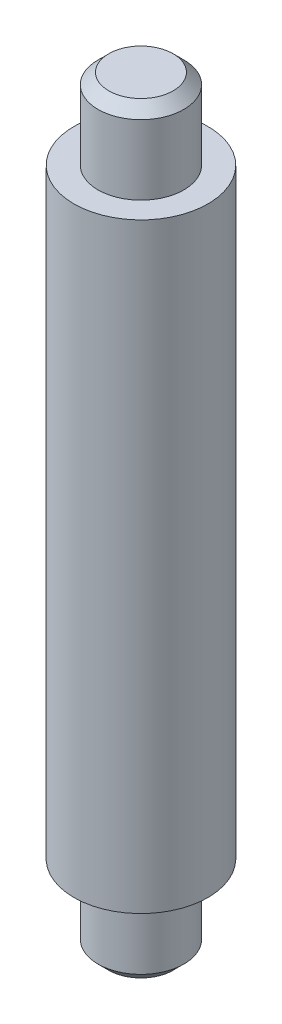
ISO-10303-21;
HEADER;
FILE_DESCRIPTION(('STEP AP214'),'2;1');
FILE_NAME('part.step','',(''),(''),'','','');
FILE_SCHEMA(('AUTOMOTIVE_DESIGN { 1 0 10303 214 1 1 1 1 }'));
ENDSEC;
DATA;
#1=APPLICATION_CONTEXT('core data for automotive mechanical design processes');
#2=APPLICATION_PROTOCOL_DEFINITION('international standard','automotive_design',2000,#1);
#3=PRODUCT_CONTEXT('',#1,'mechanical');
#4=PRODUCT('Part','Part','',(#3));
#5=PRODUCT_RELATED_PRODUCT_CATEGORY('part','',(#4));
#6=PRODUCT_DEFINITION_FORMATION('','',#4);
#7=PRODUCT_DEFINITION_CONTEXT('part definition',#1,'design');
#8=PRODUCT_DEFINITION('design','',#6,#7);
#9=PRODUCT_DEFINITION_SHAPE('','',#8);
#10=(LENGTH_UNIT() NAMED_UNIT(*) SI_UNIT(.MILLI.,.METRE.));
#11=(NAMED_UNIT(*) PLANE_ANGLE_UNIT() SI_UNIT($,.RADIAN.));
#12=(NAMED_UNIT(*) SI_UNIT($,.STERADIAN.) SOLID_ANGLE_UNIT());
#13=UNCERTAINTY_MEASURE_WITH_UNIT(LENGTH_MEASURE(1.E-05),#10,'distance_accuracy_value','');
#14=(GEOMETRIC_REPRESENTATION_CONTEXT(3) GLOBAL_UNCERTAINTY_ASSIGNED_CONTEXT((#13)) GLOBAL_UNIT_ASSIGNED_CONTEXT((#10,
#11,#12)) REPRESENTATION_CONTEXT('',''));
#15=CARTESIAN_POINT('',(0.,0.,0.));
#16=DIRECTION('',(0.,0.,1.));
#17=DIRECTION('',(1.,0.,0.));
#18=AXIS2_PLACEMENT_3D('',#15,#16,#17);
#19=CARTESIAN_POINT('',(0.,11.2,0.));
#20=DIRECTION('',(0.,-1.,0.));
#21=DIRECTION('',(0.,0.,-1.));
#22=AXIS2_PLACEMENT_3D('',#19,#20,#21);
#23=CYLINDRICAL_SURFACE('',#22,1.25);
#24=CARTESIAN_POINT('',(0.,11.2,0.));
#25=DIRECTION('',(0.,1.,0.));
#26=DIRECTION('',(0.,0.,1.));
#27=AXIS2_PLACEMENT_3D('',#24,#25,#26);
#28=CIRCLE('',#27,1.25);
#29=CARTESIAN_POINT('',(0.,11.2,1.25));
#30=VERTEX_POINT('',#29);
#31=EDGE_CURVE('E64',#30,#30,#28,.T.);
#32=ORIENTED_EDGE('',*,*,#31,.F.);
#33=EDGE_LOOP('',(#32));
#34=FACE_BOUND('',#33,.T.);
#35=CARTESIAN_POINT('',(0.,0.,0.));
#36=DIRECTION('',(0.,1.,0.));
#37=DIRECTION('',(0.,0.,1.));
#38=AXIS2_PLACEMENT_3D('',#35,#36,#37);
#39=CIRCLE('',#38,1.25);
#40=CARTESIAN_POINT('',(0.,0.,1.25));
#41=VERTEX_POINT('',#40);
#42=EDGE_CURVE('E61',#41,#41,#39,.T.);
#43=ORIENTED_EDGE('',*,*,#42,.T.);
#44=EDGE_LOOP('',(#43));
#45=FACE_BOUND('',#44,.T.);
#46=ADVANCED_FACE('F39',(#34,#45),#23,.T.);
#47=CARTESIAN_POINT('',(0.,11.2,0.));
#48=DIRECTION('',(0.,1.,0.));
#49=DIRECTION('',(0.,0.,1.));
#50=AXIS2_PLACEMENT_3D('',#47,#48,#49);
#51=PLANE('',#50);
#52=CARTESIAN_POINT('',(0.,11.2,0.));
#53=DIRECTION('',(0.,1.,0.));
#54=DIRECTION('',(0.,0.,1.));
#55=AXIS2_PLACEMENT_3D('',#52,#53,#54);
#56=CIRCLE('',#55,0.8);
#57=CARTESIAN_POINT('',(0.,11.2,0.8));
#58=VERTEX_POINT('',#57);
#59=EDGE_CURVE('E60',#58,#58,#56,.T.);
#60=ORIENTED_EDGE('',*,*,#59,.F.);
#61=EDGE_LOOP('',(#60));
#62=FACE_BOUND('',#61,.T.);
#63=ORIENTED_EDGE('',*,*,#31,.T.);
#64=EDGE_LOOP('',(#63));
#65=FACE_BOUND('',#64,.T.);
#66=ADVANCED_FACE('F92',(#62,#65),#51,.T.);
#67=CARTESIAN_POINT('',(0.,0.,0.));
#68=DIRECTION('',(0.,1.,0.));
#69=DIRECTION('',(0.,0.,1.));
#70=AXIS2_PLACEMENT_3D('',#67,#68,#69);
#71=PLANE('',#70);
#72=CARTESIAN_POINT('',(0.,0.,0.));
#73=DIRECTION('',(0.,1.,0.));
#74=DIRECTION('',(0.,0.,1.));
#75=AXIS2_PLACEMENT_3D('',#72,#73,#74);
#76=CIRCLE('',#75,0.8);
#77=CARTESIAN_POINT('',(0.,0.,0.8));
#78=VERTEX_POINT('',#77);
#79=EDGE_CURVE('E65',#78,#78,#76,.T.);
#80=ORIENTED_EDGE('',*,*,#79,.T.);
#81=EDGE_LOOP('',(#80));
#82=FACE_BOUND('',#81,.T.);
#83=ORIENTED_EDGE('',*,*,#42,.F.);
#84=EDGE_LOOP('',(#83));
#85=FACE_BOUND('',#84,.T.);
#86=ADVANCED_FACE('F73',(#82,#85),#71,.F.);
#87=CARTESIAN_POINT('',(0.,12.7,0.));
#88=DIRECTION('',(0.,-1.,0.));
#89=DIRECTION('',(0.,0.,-1.));
#90=AXIS2_PLACEMENT_3D('',#87,#88,#89);
#91=CYLINDRICAL_SURFACE('',#90,0.8);
#92=CARTESIAN_POINT('',(0.,12.5,0.));
#93=DIRECTION('',(0.,1.,0.));
#94=DIRECTION('',(0.,0.,1.));
#95=AXIS2_PLACEMENT_3D('',#92,#93,#94);
#96=CIRCLE('',#95,0.8);
#97=CARTESIAN_POINT('',(0.,12.5,0.8));
#98=VERTEX_POINT('',#97);
#99=EDGE_CURVE('E10',#98,#98,#96,.F.);
#100=ORIENTED_EDGE('',*,*,#99,.T.);
#101=EDGE_LOOP('',(#100));
#102=FACE_BOUND('',#101,.T.);
#103=ORIENTED_EDGE('',*,*,#59,.T.);
#104=EDGE_LOOP('',(#103));
#105=FACE_BOUND('',#104,.T.);
#106=ADVANCED_FACE('F89',(#102,#105),#91,.T.);
#107=CARTESIAN_POINT('',(0.,12.7,0.));
#108=DIRECTION('',(0.,1.,0.));
#109=DIRECTION('',(0.,0.,1.));
#110=AXIS2_PLACEMENT_3D('',#107,#108,#109);
#111=PLANE('',#110);
#112=CARTESIAN_POINT('',(0.,12.7,0.));
#113=DIRECTION('',(0.,1.,0.));
#114=DIRECTION('',(0.,0.,1.));
#115=AXIS2_PLACEMENT_3D('',#112,#113,#114);
#116=CIRCLE('',#115,0.599999999999998);
#117=CARTESIAN_POINT('',(0.,12.7,0.599999999999998));
#118=VERTEX_POINT('',#117);
#119=EDGE_CURVE('E47',#118,#118,#116,.T.);
#120=ORIENTED_EDGE('',*,*,#119,.T.);
#121=EDGE_LOOP('',(#120));
#122=FACE_BOUND('',#121,.T.);
#123=ADVANCED_FACE('F79',(#122),#111,.T.);
#124=CARTESIAN_POINT('',(0.,-1.5,0.));
#125=DIRECTION('',(0.,1.,0.));
#126=DIRECTION('',(0.,0.,1.));
#127=AXIS2_PLACEMENT_3D('',#124,#125,#126);
#128=CYLINDRICAL_SURFACE('',#127,0.8);
#129=CARTESIAN_POINT('',(0.,-1.3,0.));
#130=DIRECTION('',(0.,1.,0.));
#131=DIRECTION('',(0.,0.,1.));
#132=AXIS2_PLACEMENT_3D('',#129,#130,#131);
#133=CIRCLE('',#132,0.8);
#134=CARTESIAN_POINT('',(0.,-1.3,0.8));
#135=VERTEX_POINT('',#134);
#136=EDGE_CURVE('E55',#135,#135,#133,.T.);
#137=ORIENTED_EDGE('',*,*,#136,.T.);
#138=EDGE_LOOP('',(#137));
#139=FACE_BOUND('',#138,.T.);
#140=ORIENTED_EDGE('',*,*,#79,.F.);
#141=EDGE_LOOP('',(#140));
#142=FACE_BOUND('',#141,.T.);
#143=ADVANCED_FACE('F76',(#139,#142),#128,.T.);
#144=CARTESIAN_POINT('',(0.,-1.5,0.));
#145=DIRECTION('',(0.,1.,0.));
#146=DIRECTION('',(0.,0.,1.));
#147=AXIS2_PLACEMENT_3D('',#144,#145,#146);
#148=PLANE('',#147);
#149=CARTESIAN_POINT('',(0.,-1.5,0.));
#150=DIRECTION('',(0.,1.,0.));
#151=DIRECTION('',(0.,0.,1.));
#152=AXIS2_PLACEMENT_3D('',#149,#150,#151);
#153=CIRCLE('',#152,0.6);
#154=CARTESIAN_POINT('',(0.,-1.5,0.6));
#155=VERTEX_POINT('',#154);
#156=EDGE_CURVE('E51',#155,#155,#153,.F.);
#157=ORIENTED_EDGE('',*,*,#156,.T.);
#158=EDGE_LOOP('',(#157));
#159=FACE_BOUND('',#158,.T.);
#160=ADVANCED_FACE('F78',(#159),#148,.F.);
#161=CARTESIAN_POINT('',(0.,-1.3,0.));
#162=DIRECTION('',(0.,1.,0.));
#163=DIRECTION('',(0.,0.,1.));
#164=AXIS2_PLACEMENT_3D('',#161,#162,#163);
#165=CONICAL_SURFACE('',#164,0.8,0.785398163397446);
#166=ORIENTED_EDGE('',*,*,#156,.F.);
#167=EDGE_LOOP('',(#166));
#168=FACE_BOUND('',#167,.T.);
#169=ORIENTED_EDGE('',*,*,#136,.F.);
#170=EDGE_LOOP('',(#169));
#171=FACE_BOUND('',#170,.T.);
#172=ADVANCED_FACE('F86',(#168,#171),#165,.T.);
#173=CARTESIAN_POINT('',(0.,12.7,0.));
#174=DIRECTION('',(0.,-1.,0.));
#175=DIRECTION('',(0.,0.,-1.));
#176=AXIS2_PLACEMENT_3D('',#173,#174,#175);
#177=CONICAL_SURFACE('',#176,0.599999999999998,0.785398163397452);
#178=ORIENTED_EDGE('',*,*,#99,.F.);
#179=EDGE_LOOP('',(#178));
#180=FACE_BOUND('',#179,.T.);
#181=ORIENTED_EDGE('',*,*,#119,.F.);
#182=EDGE_LOOP('',(#181));
#183=FACE_BOUND('',#182,.T.);
#184=ADVANCED_FACE('F42',(#180,#183),#177,.T.);
#185=CLOSED_SHELL('',(#46,#66,#86,#106,#123,#143,#160,#172,#184));
#186=MANIFOLD_SOLID_BREP('B2',#185);
#187=ADVANCED_BREP_SHAPE_REPRESENTATION('',(#18,#186),#14);
#188=SHAPE_DEFINITION_REPRESENTATION(#9,#187);
ENDSEC;
END-ISO-10303-21;
